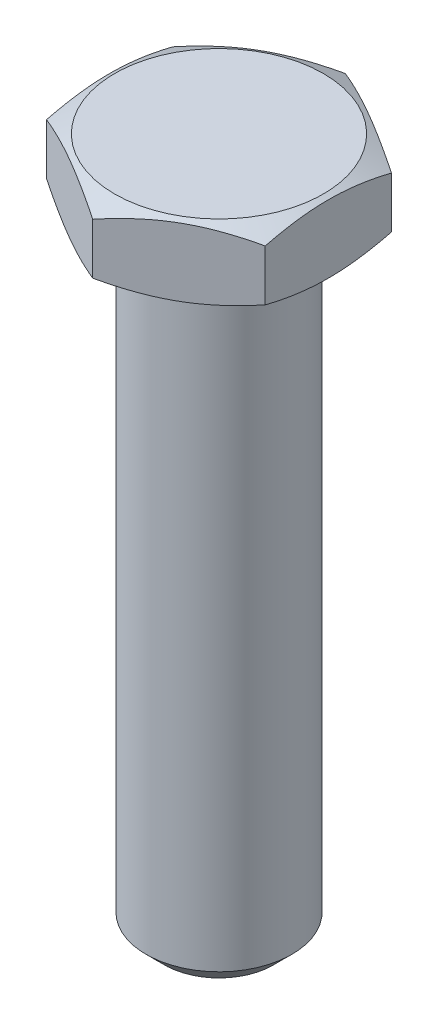
ISO-10303-21;
HEADER;
FILE_DESCRIPTION(('STEP AP214'),'2;1');
FILE_NAME('part.step','',(''),(''),'','','');
FILE_SCHEMA(('AUTOMOTIVE_DESIGN { 1 0 10303 214 1 1 1 1 }'));
ENDSEC;
DATA;
#1=APPLICATION_CONTEXT('core data for automotive mechanical design processes');
#2=APPLICATION_PROTOCOL_DEFINITION('international standard','automotive_design',2000,#1);
#3=PRODUCT_CONTEXT('',#1,'mechanical');
#4=PRODUCT('Part','Part','',(#3));
#5=PRODUCT_RELATED_PRODUCT_CATEGORY('part','',(#4));
#6=PRODUCT_DEFINITION_FORMATION('','',#4);
#7=PRODUCT_DEFINITION_CONTEXT('part definition',#1,'design');
#8=PRODUCT_DEFINITION('design','',#6,#7);
#9=PRODUCT_DEFINITION_SHAPE('','',#8);
#10=(LENGTH_UNIT() NAMED_UNIT(*) SI_UNIT(.MILLI.,.METRE.));
#11=(NAMED_UNIT(*) PLANE_ANGLE_UNIT() SI_UNIT($,.RADIAN.));
#12=(NAMED_UNIT(*) SI_UNIT($,.STERADIAN.) SOLID_ANGLE_UNIT());
#13=UNCERTAINTY_MEASURE_WITH_UNIT(LENGTH_MEASURE(1.E-05),#10,'distance_accuracy_value','');
#14=(GEOMETRIC_REPRESENTATION_CONTEXT(3) GLOBAL_UNCERTAINTY_ASSIGNED_CONTEXT((#13)) GLOBAL_UNIT_ASSIGNED_CONTEXT((#10,
#11,#12)) REPRESENTATION_CONTEXT('',''));
#15=CARTESIAN_POINT('',(0.,0.,0.));
#16=DIRECTION('',(0.,0.,1.));
#17=DIRECTION('',(1.,0.,0.));
#18=AXIS2_PLACEMENT_3D('',#15,#16,#17);
#19=CARTESIAN_POINT('',(0.,0.,0.));
#20=DIRECTION('',(0.,1.,0.));
#21=DIRECTION('',(0.,0.,1.));
#22=AXIS2_PLACEMENT_3D('',#19,#20,#21);
#23=PLANE('',#22);
#24=CARTESIAN_POINT('',(0.,0.,0.));
#25=DIRECTION('',(0.,-1.,0.));
#26=DIRECTION('',(0.,0.,-1.));
#27=AXIS2_PLACEMENT_3D('',#24,#25,#26);
#28=CIRCLE('',#27,2.);
#29=CARTESIAN_POINT('',(0.,0.,-2.));
#30=VERTEX_POINT('',#29);
#31=EDGE_CURVE('E127',#30,#30,#28,.T.);
#32=ORIENTED_EDGE('',*,*,#31,.F.);
#33=EDGE_LOOP('',(#32));
#34=FACE_BOUND('',#33,.T.);
#35=CARTESIAN_POINT('',(0.,0.,0.));
#36=DIRECTION('',(0.,-1.,0.));
#37=DIRECTION('',(0.,0.,-1.));
#38=AXIS2_PLACEMENT_3D('',#35,#36,#37);
#39=CIRCLE('',#38,2.86410161513776);
#40=CARTESIAN_POINT('',(0.,0.,-2.86410161513776));
#41=VERTEX_POINT('',#40);
#42=EDGE_CURVE('E259',#41,#41,#39,.T.);
#43=ORIENTED_EDGE('',*,*,#42,.T.);
#44=EDGE_LOOP('',(#43));
#45=FACE_BOUND('',#44,.T.);
#46=ADVANCED_FACE('F41',(#34,#45),#23,.F.);
#47=CARTESIAN_POINT('',(0.,-17.,0.));
#48=DIRECTION('',(0.,1.,0.));
#49=DIRECTION('',(0.,0.,1.));
#50=AXIS2_PLACEMENT_3D('',#47,#48,#49);
#51=CYLINDRICAL_SURFACE('',#50,2.);
#52=CARTESIAN_POINT('',(0.,-16.5,0.));
#53=DIRECTION('',(0.,-1.,0.));
#54=DIRECTION('',(0.,0.,-1.));
#55=AXIS2_PLACEMENT_3D('',#52,#53,#54);
#56=CIRCLE('',#55,2.);
#57=CARTESIAN_POINT('',(0.,-16.5,-2.));
#58=VERTEX_POINT('',#57);
#59=EDGE_CURVE('E11',#58,#58,#56,.F.);
#60=ORIENTED_EDGE('',*,*,#59,.T.);
#61=EDGE_LOOP('',(#60));
#62=FACE_BOUND('',#61,.T.);
#63=ORIENTED_EDGE('',*,*,#31,.T.);
#64=EDGE_LOOP('',(#63));
#65=FACE_BOUND('',#64,.T.);
#66=ADVANCED_FACE('F237',(#62,#65),#51,.T.);
#67=CARTESIAN_POINT('',(0.,-17.,0.));
#68=DIRECTION('',(0.,-1.,0.));
#69=DIRECTION('',(0.,0.,-1.));
#70=AXIS2_PLACEMENT_3D('',#67,#68,#69);
#71=PLANE('',#70);
#72=CARTESIAN_POINT('',(0.,-17.,0.));
#73=DIRECTION('',(0.,-1.,0.));
#74=DIRECTION('',(0.,0.,-1.));
#75=AXIS2_PLACEMENT_3D('',#72,#73,#74);
#76=CIRCLE('',#75,1.50000000000001);
#77=CARTESIAN_POINT('',(0.,-17.,-1.50000000000001));
#78=VERTEX_POINT('',#77);
#79=EDGE_CURVE('E50',#78,#78,#76,.T.);
#80=ORIENTED_EDGE('',*,*,#79,.T.);
#81=EDGE_LOOP('',(#80));
#82=FACE_BOUND('',#81,.T.);
#83=ADVANCED_FACE('F243',(#82),#71,.T.);
#84=CARTESIAN_POINT('',(0.,-17.,0.));
#85=DIRECTION('',(0.,1.,0.));
#86=DIRECTION('',(0.,0.,1.));
#87=AXIS2_PLACEMENT_3D('',#84,#85,#86);
#88=CONICAL_SURFACE('',#87,1.50000000000001,0.785398163397448);
#89=ORIENTED_EDGE('',*,*,#59,.F.);
#90=EDGE_LOOP('',(#89));
#91=FACE_BOUND('',#90,.T.);
#92=ORIENTED_EDGE('',*,*,#79,.F.);
#93=EDGE_LOOP('',(#92));
#94=FACE_BOUND('',#93,.T.);
#95=ADVANCED_FACE('F44',(#91,#94),#88,.T.);
#96=CARTESIAN_POINT('',(0.,0.,0.));
#97=DIRECTION('',(0.,1.,0.));
#98=DIRECTION('',(0.,0.,1.));
#99=AXIS2_PLACEMENT_3D('',#96,#97,#98);
#100=CONICAL_SURFACE('',#99,2.86410161513776,1.10714871779409);
#101=ORIENTED_EDGE('',*,*,#42,.F.);
#102=EDGE_LOOP('',(#101));
#103=FACE_BOUND('',#102,.T.);
#104=CARTESIAN_POINT('',(0.0002,0.300057737913574,3.4642170851916));
#105=CARTESIAN_POINT('',(-0.0843576975081392,0.275647401119735,3.41539767577322));
#106=CARTESIAN_POINT('',(-0.169244830523354,0.252685545957684,3.36638806667615));
#107=CARTESIAN_POINT('',(-0.339695256808321,0.210142328352822,3.26797846717704));
#108=CARTESIAN_POINT('',(-0.425258874743314,0.190562706924008,3.21857828932943));
#109=CARTESIAN_POINT('',(-0.597119853282431,0.15526744743101,3.11935430710668));
#110=CARTESIAN_POINT('',(-0.683418112738016,0.139557573650432,3.0695299837794));
#111=CARTESIAN_POINT('',(-0.856518299579659,0.112523608519719,2.96959054430961));
#112=CARTESIAN_POINT('',(-0.943320137526851,0.101198761186187,2.91947547980464));
#113=CARTESIAN_POINT('',(-1.11532356000646,0.0835326143848697,2.8201692575345));
#114=CARTESIAN_POINT('',(-1.20051680390757,0.0770841419711611,2.77098291523506));
#115=CARTESIAN_POINT('',(-1.3710806980937,0.0689930139080331,2.67250780501267));
#116=CARTESIAN_POINT('',(-1.4564513569198,0.0673505952579314,2.62321903215853));
#117=CARTESIAN_POINT('',(-1.62706618222961,0.0689352741171345,2.52471451683817));
#118=CARTESIAN_POINT('',(-1.71231038587662,0.0721571252475173,2.47549875291571));
#119=CARTESIAN_POINT('',(-1.88255588188678,0.0833364795480117,2.37720746996593));
#120=CARTESIAN_POINT('',(-1.96755719433661,0.0912935790212909,2.32813193934154));
#121=CARTESIAN_POINT('',(-2.13183052204708,0.111015671851011,2.23328868936723));
#122=CARTESIAN_POINT('',(-2.21112723767509,0.122510276351391,2.18750670925355));
#123=CARTESIAN_POINT('',(-2.36927515535497,0.149078979856735,2.09619996640929));
#124=CARTESIAN_POINT('',(-2.44812630887963,0.164153461344515,2.05067523169592));
#125=CARTESIAN_POINT('',(-2.60619009037454,0.197692594574929,1.9594170649007));
#126=CARTESIAN_POINT('',(-2.68539694087637,0.216193183407675,1.91368696844181));
#127=CARTESIAN_POINT('',(-2.84322932268019,0.256068030127482,1.82256240032053));
#128=CARTESIAN_POINT('',(-2.92185510791947,0.277440943484195,1.77716778204739));
#129=CARTESIAN_POINT('',(-3.00019999999998,0.300057737913565,1.73193533751508));
#130=B_SPLINE_CURVE_WITH_KNOTS('',3,(#104,#105,#106,#107,#108,#109,#110,#111,#112,#113,#114,
#115,#116,#117,#118,#119,#120,#121,#122,#123,#124,#125,#126,#127,#128,#129),.UNSPECIFIED.,.F.,
.F.,(4,2,2,2,2,2,2,2,2,2,2,2,4),(0.,0.30194726219014,0.604049492370199,0.906599041906776,
1.20909640831849,1.50473507111981,1.8003883124057,2.09572290334755,2.39103231956712,
2.6678041927483,2.94460565022812,3.22449442184109,3.50425263138383),.UNSPECIFIED.);
#131=CARTESIAN_POINT('',(0.,0.3,3.46410161513776));
#132=VERTEX_POINT('',#131);
#133=CARTESIAN_POINT('',(-2.99999999999998,0.3,1.73205080756891));
#134=VERTEX_POINT('',#133);
#135=EDGE_CURVE('E65',#132,#134,#130,.T.);
#136=ORIENTED_EDGE('',*,*,#135,.T.);
#137=CARTESIAN_POINT('',(-2.99999999999995,1.57365208973094,5.20931853771167));
#138=CARTESIAN_POINT('',(-2.99999999999995,1.50998777174429,5.06234715778561));
#139=CARTESIAN_POINT('',(-2.99999999999995,1.44686080061693,4.91513933371793));
#140=CARTESIAN_POINT('',(-2.99999999999995,1.32200063682017,4.62011582974534));
#141=CARTESIAN_POINT('',(-2.99999999999995,1.2602675937212,4.47230008660262));
#142=CARTESIAN_POINT('',(-2.99999999999996,1.13833486888092,4.17548672752289));
#143=CARTESIAN_POINT('',(-2.99999999999996,1.0781406771681,4.02648684930349));
#144=CARTESIAN_POINT('',(-2.99999999999996,0.959955050135367,3.72761884619292));
#145=CARTESIAN_POINT('',(-2.99999999999996,0.901963544184566,3.57775074931979));
#146=CARTESIAN_POINT('',(-2.99999999999997,0.788824882896837,3.27703540236973));
#147=CARTESIAN_POINT('',(-2.99999999999997,0.733676151974605,3.12618874800314));
#148=CARTESIAN_POINT('',(-2.99999999999997,0.62700695322521,2.82319976965895));
#149=CARTESIAN_POINT('',(-2.99999999999997,0.57548672764544,2.67105735993236));
#150=CARTESIAN_POINT('',(-2.99999999999998,0.477215570873933,2.36535124180871));
#151=CARTESIAN_POINT('',(-2.99999999999998,0.430460988404545,2.21178872135961));
#152=CARTESIAN_POINT('',(-2.99999999999998,0.343122134809374,1.90294104127946));
#153=CARTESIAN_POINT('',(-2.99999999999998,0.302536863189613,1.74765616535957));
#154=CARTESIAN_POINT('',(-2.99999999999999,0.217243398300895,1.3835825245628));
#155=CARTESIAN_POINT('',(-2.99999999999999,0.175590776953814,1.17404022002667));
#156=CARTESIAN_POINT('',(-2.99999999999999,0.127234224923284,0.857651670539613));
#157=CARTESIAN_POINT('',(-2.99999999999999,0.113470919288,0.751871866627188));
#158=CARTESIAN_POINT('',(-2.99999999999999,0.0911544101081223,0.53977059339254));
#159=CARTESIAN_POINT('',(-3.,0.0826003365060806,0.433449217517799));
#160=CARTESIAN_POINT('',(-3.,0.0710718074881545,0.220640891235554));
#161=CARTESIAN_POINT('',(-3.,0.0680900601100706,0.114154339976398));
#162=CARTESIAN_POINT('',(-3.,0.0678181153856516,-0.0988254262630418));
#163=CARTESIAN_POINT('',(-3.,0.0705278807725636,-0.205318641195128));
#164=CARTESIAN_POINT('',(-3.,0.0815180697245937,-0.41804688347734));
#165=CARTESIAN_POINT('',(-3.00000000000001,0.089800193781176,-0.524281822075484));
#166=CARTESIAN_POINT('',(-3.00000000000001,0.111584885970215,-0.736208045596922));
#167=CARTESIAN_POINT('',(-3.00000000000001,0.12508766374203,-0.841899308515779));
#168=CARTESIAN_POINT('',(-3.00000000000001,0.196196382554001,-1.31427546343626));
#169=CARTESIAN_POINT('',(-3.00000000000002,0.280033014659497,-1.67705776370225));
#170=CARTESIAN_POINT('',(-3.00000000000002,0.430754802063309,-2.21409746209015));
#171=CARTESIAN_POINT('',(-3.00000000000003,0.485302440571465,-2.39230116942601));
#172=CARTESIAN_POINT('',(-3.00000000000003,0.600580616156178,-2.74671776798335));
#173=CARTESIAN_POINT('',(-3.00000000000003,0.661310093073063,-2.92293099482464));
#174=CARTESIAN_POINT('',(-3.00000000000003,0.78873332759138,-3.27766551467015));
#175=CARTESIAN_POINT('',(-3.00000000000004,0.855531002285068,-3.4561487162901));
#176=CARTESIAN_POINT('',(-3.00000000000004,0.99265452512781,-3.811767109759));
#177=CARTESIAN_POINT('',(-3.00000000000004,1.06298061784278,-3.9889022071838));
#178=CARTESIAN_POINT('',(-3.00000000000005,1.20559269856673,-4.34040797090196));
#179=CARTESIAN_POINT('',(-3.00000000000005,1.27785357559381,-4.51478888607757));
#180=CARTESIAN_POINT('',(-3.00000000000005,1.42438447887457,-4.86266009428369));
#181=CARTESIAN_POINT('',(-3.00000000000005,1.49865405429227,-5.03615057693348));
#182=CARTESIAN_POINT('',(-3.00000000000005,1.57365208973094,-5.2093185377116));
#183=B_SPLINE_CURVE_WITH_KNOTS('',3,(#137,#138,#139,#140,#141,#142,#143,#144,#145,#146,#147,
#148,#149,#150,#151,#152,#153,#154,#155,#156,#157,#158,#159,#160,#161,#162,#163,#164,#165,#166,
#167,#168,#169,#170,#171,#172,#173,#174,#175,#176,#177,#178,#179,#180,#181,#182),.UNSPECIFIED.,
.F.,.F.,(4,2,2,2,2,2,2,2,2,2,2,2,2,2,2,2,2,2,2,2,2,2,4),(0.,0.480507448937208,0.961066214313064,
1.44315057868083,1.9252194715518,2.40701824365513,2.88884915132465,3.37030807653175,
3.85168883873877,4.49184876467322,4.81175569931051,5.13160918771951,5.45104382104259,
5.77047636278564,6.090006428551,6.40954932662424,7.52291980310329,8.08204041752274,
8.64106530610462,9.21274892896984,9.7844722319424,10.3507390280429,10.916879767946),.UNSPECIFIED.);
#184=CARTESIAN_POINT('',(-3.00000000000002,0.3,-1.73205080756885));
#185=VERTEX_POINT('',#184);
#186=EDGE_CURVE('E98',#134,#185,#183,.T.);
#187=ORIENTED_EDGE('',*,*,#186,.T.);
#188=CARTESIAN_POINT('',(-3.00020000000002,0.300057737913574,-1.73193533751501));
#189=CARTESIAN_POINT('',(-2.91564230249188,0.275647401119734,-1.78075474693339));
#190=CARTESIAN_POINT('',(-2.83075516947666,0.252685545957683,-1.82976435603046));
#191=CARTESIAN_POINT('',(-2.6603047431917,0.21014232835282,-1.92817395552958));
#192=CARTESIAN_POINT('',(-2.57474112525671,0.190562706924006,-1.97757413337718));
#193=CARTESIAN_POINT('',(-2.40288014671759,0.155267447431008,-2.07679811559994));
#194=CARTESIAN_POINT('',(-2.31658188726201,0.139557573650429,-2.12662243892722));
#195=CARTESIAN_POINT('',(-2.14348170042036,0.112523608519715,-2.22656187839701));
#196=CARTESIAN_POINT('',(-2.05667986247317,0.101198761186183,-2.27667694290198));
#197=CARTESIAN_POINT('',(-1.88467643999356,0.0835326143848648,-2.37598316517212));
#198=CARTESIAN_POINT('',(-1.79948319609245,0.0770841419711559,-2.42516950747157));
#199=CARTESIAN_POINT('',(-1.62891930190632,0.0689930139080275,-2.52364461769396));
#200=CARTESIAN_POINT('',(-1.54354864308023,0.0673505952579256,-2.5729333905481));
#201=CARTESIAN_POINT('',(-1.37293381777042,0.0689352741171282,-2.67143790586847));
#202=CARTESIAN_POINT('',(-1.2876896141234,0.0721571252475105,-2.72065366979093));
#203=CARTESIAN_POINT('',(-1.11744411811325,0.0833364795480045,-2.81894495274071));
#204=CARTESIAN_POINT('',(-1.03244280566342,0.0912935790212837,-2.86802048336509));
#205=CARTESIAN_POINT('',(-0.86816947795295,0.111015671851003,-2.96286373333941));
#206=CARTESIAN_POINT('',(-0.788872762324933,0.122510276351384,-3.0086457134531));
#207=CARTESIAN_POINT('',(-0.630724844645052,0.149078979856729,-3.09995245629736));
#208=CARTESIAN_POINT('',(-0.551873691120394,0.16415346134451,-3.14547719101073));
#209=CARTESIAN_POINT('',(-0.393809909625476,0.197692594574925,-3.23673535780596));
#210=CARTESIAN_POINT('',(-0.314603059123648,0.216193183407671,-3.28246545426485));
#211=CARTESIAN_POINT('',(-0.156770677319818,0.25606803012748,-3.37359002238613));
#212=CARTESIAN_POINT('',(-0.0781448920805363,0.277440943484193,-3.41898464065928));
#213=CARTESIAN_POINT('',(0.000199999999976549,0.300057737913565,-3.4642170851916));
#214=B_SPLINE_CURVE_WITH_KNOTS('',3,(#188,#189,#190,#191,#192,#193,#194,#195,#196,#197,#198,
#199,#200,#201,#202,#203,#204,#205,#206,#207,#208,#209,#210,#211,#212,#213),.UNSPECIFIED.,.F.,
.F.,(4,2,2,2,2,2,2,2,2,2,2,2,4),(0.,0.301947262190141,0.604049492370201,0.90659904190678,
1.20909640831849,1.50473507111981,1.8003883124057,2.09572290334756,2.39103231956712,
2.66780419274832,2.94460565022814,3.22449442184113,3.50425263138387),.UNSPECIFIED.);
#215=CARTESIAN_POINT('',(0.,0.3,-3.46410161513776));
#216=VERTEX_POINT('',#215);
#217=EDGE_CURVE('E93',#185,#216,#214,.T.);
#218=ORIENTED_EDGE('',*,*,#217,.T.);
#219=CARTESIAN_POINT('',(-0.00020000000002419,0.300057737913574,-3.46421708519159));
#220=CARTESIAN_POINT('',(0.0843576975081151,0.275647401119734,-3.41539767577322));
#221=CARTESIAN_POINT('',(0.16924483052333,0.252685545957683,-3.36638806667615));
#222=CARTESIAN_POINT('',(0.339695256808297,0.21014232835282,-3.26797846717704));
#223=CARTESIAN_POINT('',(0.42525887474329,0.190562706924006,-3.21857828932943));
#224=CARTESIAN_POINT('',(0.597119853282408,0.155267447431007,-3.11935430710668));
#225=CARTESIAN_POINT('',(0.683418112737993,0.139557573650428,-3.0695299837794));
#226=CARTESIAN_POINT('',(0.856518299579637,0.112523608519715,-2.96959054430961));
#227=CARTESIAN_POINT('',(0.943320137526829,0.101198761186183,-2.91947547980464));
#228=CARTESIAN_POINT('',(1.11532356000644,0.0835326143848647,-2.8201692575345));
#229=CARTESIAN_POINT('',(1.20051680390755,0.0770841419711557,-2.77098291523506));
#230=CARTESIAN_POINT('',(1.37108069809368,0.0689930139080273,-2.67250780501267));
#231=CARTESIAN_POINT('',(1.45645135691978,0.0673505952579254,-2.62321903215852));
#232=CARTESIAN_POINT('',(1.62706618222959,0.068935274117128,-2.52471451683816));
#233=CARTESIAN_POINT('',(1.7123103858766,0.0721571252475103,-2.47549875291571));
#234=CARTESIAN_POINT('',(1.88255588188676,0.0833364795480044,-2.37720746996592));
#235=CARTESIAN_POINT('',(1.96755719433659,0.0912935790212837,-2.32813193934154));
#236=CARTESIAN_POINT('',(2.13183052204706,0.111015671851003,-2.23328868936723));
#237=CARTESIAN_POINT('',(2.21112723767508,0.122510276351384,-2.18750670925354));
#238=CARTESIAN_POINT('',(2.36927515535496,0.149078979856729,-2.09619996640928));
#239=CARTESIAN_POINT('',(2.44812630887962,0.16415346134451,-2.05067523169591));
#240=CARTESIAN_POINT('',(2.60619009037454,0.197692594574925,-1.95941706490069));
#241=CARTESIAN_POINT('',(2.68539694087637,0.216193183407671,-1.9136869684418));
#242=CARTESIAN_POINT('',(2.8432293226802,0.25606803012748,-1.82256240032051));
#243=CARTESIAN_POINT('',(2.92185510791948,0.277440943484194,-1.77716778204737));
#244=CARTESIAN_POINT('',(3.0002,0.300057737913565,-1.73193533751505));
#245=B_SPLINE_CURVE_WITH_KNOTS('',3,(#219,#220,#221,#222,#223,#224,#225,#226,#227,#228,#229,
#230,#231,#232,#233,#234,#235,#236,#237,#238,#239,#240,#241,#242,#243,#244),.UNSPECIFIED.,.F.,
.F.,(4,2,2,2,2,2,2,2,2,2,2,2,4),(0.,0.301947262190141,0.604049492370201,0.906599041906779,
1.20909640831849,1.50473507111981,1.8003883124057,2.09572290334756,2.39103231956712,
2.66780419274832,2.94460565022814,3.22449442184113,3.50425263138387),.UNSPECIFIED.);
#246=CARTESIAN_POINT('',(2.99999999999999,0.3,-1.73205080756889));
#247=VERTEX_POINT('',#246);
#248=EDGE_CURVE('E96',#216,#247,#245,.T.);
#249=ORIENTED_EDGE('',*,*,#248,.T.);
#250=CARTESIAN_POINT('',(2.99999999999998,1.57365208973094,-5.20931853771164));
#251=CARTESIAN_POINT('',(2.99999999999998,1.50998777174429,-5.06234715778559));
#252=CARTESIAN_POINT('',(2.99999999999998,1.44686080061693,-4.91513933371791));
#253=CARTESIAN_POINT('',(2.99999999999998,1.32200063682017,-4.62011582974532));
#254=CARTESIAN_POINT('',(2.99999999999999,1.2602675937212,-4.47230008660259));
#255=CARTESIAN_POINT('',(2.99999999999999,1.13833486888092,-4.17548672752287));
#256=CARTESIAN_POINT('',(2.99999999999999,1.0781406771681,-4.02648684930347));
#257=CARTESIAN_POINT('',(2.99999999999999,0.959955050135367,-3.7276188461929));
#258=CARTESIAN_POINT('',(2.99999999999999,0.901963544184565,-3.57775074931977));
#259=CARTESIAN_POINT('',(2.99999999999999,0.788824882896836,-3.27703540236971));
#260=CARTESIAN_POINT('',(2.99999999999999,0.733676151974604,-3.12618874800312));
#261=CARTESIAN_POINT('',(2.99999999999999,0.627006953225211,-2.82319976965892));
#262=CARTESIAN_POINT('',(2.99999999999999,0.57548672764544,-2.67105735993234));
#263=CARTESIAN_POINT('',(2.99999999999999,0.477215570873933,-2.36535124180869));
#264=CARTESIAN_POINT('',(2.99999999999999,0.430460988404545,-2.21178872135959));
#265=CARTESIAN_POINT('',(2.99999999999999,0.343122134809374,-1.90294104127944));
#266=CARTESIAN_POINT('',(2.99999999999999,0.302536863189613,-1.74765616535955));
#267=CARTESIAN_POINT('',(3.,0.217243398300895,-1.38358252456278));
#268=CARTESIAN_POINT('',(3.,0.175590776953814,-1.17404022002664));
#269=CARTESIAN_POINT('',(3.,0.127234224923284,-0.85765167053959));
#270=CARTESIAN_POINT('',(3.,0.113470919288,-0.751871866627165));
#271=CARTESIAN_POINT('',(3.,0.0911544101081221,-0.539770593392516));
#272=CARTESIAN_POINT('',(3.,0.0826003365060805,-0.433449217517775));
#273=CARTESIAN_POINT('',(3.,0.0710718074881544,-0.220640891235532));
#274=CARTESIAN_POINT('',(3.,0.0680900601100706,-0.114154339976376));
#275=CARTESIAN_POINT('',(3.,0.0678181153856516,0.0988254262630639));
#276=CARTESIAN_POINT('',(3.,0.0705278807725635,0.205318641195151));
#277=CARTESIAN_POINT('',(3.,0.0815180697245936,0.418046883477362));
#278=CARTESIAN_POINT('',(3.,0.089800193781176,0.524281822075506));
#279=CARTESIAN_POINT('',(3.,0.111584885970216,0.736208045596944));
#280=CARTESIAN_POINT('',(3.,0.12508766374203,0.841899308515801));
#281=CARTESIAN_POINT('',(3.,0.196196382554001,1.31427546343628));
#282=CARTESIAN_POINT('',(3.00000000000001,0.280033014659497,1.67705776370227));
#283=CARTESIAN_POINT('',(3.00000000000001,0.430754802063309,2.21409746209017));
#284=CARTESIAN_POINT('',(3.00000000000001,0.485302440571465,2.39230116942603));
#285=CARTESIAN_POINT('',(3.00000000000001,0.600580616156178,2.74671776798337));
#286=CARTESIAN_POINT('',(3.00000000000001,0.661310093073063,2.92293099482466));
#287=CARTESIAN_POINT('',(3.00000000000001,0.78873332759138,3.27766551467017));
#288=CARTESIAN_POINT('',(3.00000000000001,0.855531002285067,3.45614871629012));
#289=CARTESIAN_POINT('',(3.00000000000001,0.992654525127809,3.81176710975902));
#290=CARTESIAN_POINT('',(3.00000000000001,1.06298061784278,3.98890220718382));
#291=CARTESIAN_POINT('',(3.00000000000001,1.20559269856673,4.34040797090198));
#292=CARTESIAN_POINT('',(3.00000000000001,1.27785357559381,4.51478888607759));
#293=CARTESIAN_POINT('',(3.00000000000002,1.42438447887457,4.86266009428371));
#294=CARTESIAN_POINT('',(3.00000000000002,1.49865405429227,5.0361505769335));
#295=CARTESIAN_POINT('',(3.00000000000002,1.57365208973094,5.20931853771162));
#296=B_SPLINE_CURVE_WITH_KNOTS('',3,(#250,#251,#252,#253,#254,#255,#256,#257,#258,#259,#260,
#261,#262,#263,#264,#265,#266,#267,#268,#269,#270,#271,#272,#273,#274,#275,#276,#277,#278,#279,
#280,#281,#282,#283,#284,#285,#286,#287,#288,#289,#290,#291,#292,#293,#294,#295),.UNSPECIFIED.,
.F.,.F.,(4,2,2,2,2,2,2,2,2,2,2,2,2,2,2,2,2,2,2,2,2,2,4),(0.,0.480507448937209,0.961066214313064,
1.44315057868083,1.9252194715518,2.40701824365513,2.88884915132465,3.37030807653175,
3.85168883873877,4.49184876467322,4.81175569931051,5.13160918771951,5.45104382104259,
5.77047636278564,6.090006428551,6.40954932662424,7.52291980310329,8.08204041752274,
8.64106530610462,9.21274892896984,9.7844722319424,10.3507390280429,10.916879767946),.UNSPECIFIED.);
#297=CARTESIAN_POINT('',(3.00000000000001,0.3,1.73205080756887));
#298=VERTEX_POINT('',#297);
#299=EDGE_CURVE('E112',#247,#298,#296,.T.);
#300=ORIENTED_EDGE('',*,*,#299,.T.);
#301=CARTESIAN_POINT('',(3.00020000000001,0.300057737913574,1.73193533751503));
#302=CARTESIAN_POINT('',(2.91564230249187,0.275647401119734,1.78075474693341));
#303=CARTESIAN_POINT('',(2.83075516947665,0.252685545957683,1.82976435603048));
#304=CARTESIAN_POINT('',(2.66030474319169,0.21014232835282,1.9281739555296));
#305=CARTESIAN_POINT('',(2.57474112525669,0.190562706924006,1.9775741333772));
#306=CARTESIAN_POINT('',(2.40288014671758,0.155267447431008,2.07679811559995));
#307=CARTESIAN_POINT('',(2.31658188726199,0.139557573650429,2.12662243892723));
#308=CARTESIAN_POINT('',(2.14348170042035,0.112523608519715,2.22656187839703));
#309=CARTESIAN_POINT('',(2.05667986247316,0.101198761186183,2.27667694290199));
#310=CARTESIAN_POINT('',(1.88467643999354,0.0835326143848648,2.37598316517214));
#311=CARTESIAN_POINT('',(1.79948319609244,0.0770841419711559,2.42516950747158));
#312=CARTESIAN_POINT('',(1.62891930190631,0.0689930139080275,2.52364461769397));
#313=CARTESIAN_POINT('',(1.54354864308021,0.0673505952579255,2.57293339054811));
#314=CARTESIAN_POINT('',(1.3729338177704,0.0689352741171282,2.67143790586848));
#315=CARTESIAN_POINT('',(1.28768961412338,0.0721571252475107,2.72065366979093));
#316=CARTESIAN_POINT('',(1.11744411811323,0.0833364795480046,2.81894495274072));
#317=CARTESIAN_POINT('',(1.0324428056634,0.0912935790212837,2.8680204833651));
#318=CARTESIAN_POINT('',(0.86816947795293,0.111015671851003,2.96286373333941));
#319=CARTESIAN_POINT('',(0.788872762324912,0.122510276351384,3.0086457134531));
#320=CARTESIAN_POINT('',(0.630724844645031,0.14907897985673,3.09995245629736));
#321=CARTESIAN_POINT('',(0.551873691120372,0.16415346134451,3.14547719101074));
#322=CARTESIAN_POINT('',(0.393809909625454,0.197692594574925,3.23673535780596));
#323=CARTESIAN_POINT('',(0.314603059123625,0.216193183407671,3.28246545426485));
#324=CARTESIAN_POINT('',(0.156770677319794,0.25606803012748,3.37359002238613));
#325=CARTESIAN_POINT('',(0.0781448920805121,0.277440943484194,3.41898464065928));
#326=CARTESIAN_POINT('',(-0.000200000000000854,0.300057737913565,3.4642170851916));
#327=B_SPLINE_CURVE_WITH_KNOTS('',3,(#301,#302,#303,#304,#305,#306,#307,#308,#309,#310,#311,
#312,#313,#314,#315,#316,#317,#318,#319,#320,#321,#322,#323,#324,#325,#326),.UNSPECIFIED.,.F.,
.F.,(4,2,2,2,2,2,2,2,2,2,2,2,4),(0.,0.301947262190141,0.604049492370202,0.906599041906779,
1.20909640831849,1.50473507111981,1.8003883124057,2.09572290334756,2.39103231956712,
2.66780419274832,2.94460565022814,3.22449442184113,3.50425263138387),.UNSPECIFIED.);
#328=EDGE_CURVE('E220',#298,#132,#327,.T.);
#329=ORIENTED_EDGE('',*,*,#328,.T.);
#330=EDGE_LOOP('',(#136,#187,#218,#249,#300,#329));
#331=FACE_BOUND('',#330,.T.);
#332=ADVANCED_FACE('F95',(#103,#331),#100,.T.);
#333=CARTESIAN_POINT('',(-3.00000000000002,2.,-1.73205080756885));
#334=DIRECTION('',(1.,0.,0.));
#335=DIRECTION('',(0.,0.,-1.));
#336=AXIS2_PLACEMENT_3D('',#333,#334,#335);
#337=PLANE('',#336);
#338=CARTESIAN_POINT('',(-3.00000000000005,0.426347910269061,-5.2093185377116));
#339=CARTESIAN_POINT('',(-3.00000000000005,0.490012228255707,-5.06234715778555));
#340=CARTESIAN_POINT('',(-3.00000000000005,0.553139199383066,-4.91513933371787));
#341=CARTESIAN_POINT('',(-3.00000000000005,0.677999363179832,-4.62011582974528));
#342=CARTESIAN_POINT('',(-3.00000000000005,0.739732406278803,-4.47230008660255));
#343=CARTESIAN_POINT('',(-3.00000000000004,0.861665131119081,-4.17548672752283));
#344=CARTESIAN_POINT('',(-3.00000000000004,0.921859322831904,-4.02648684930343));
#345=CARTESIAN_POINT('',(-3.00000000000004,1.04004494986463,-3.72761884619286));
#346=CARTESIAN_POINT('',(-3.00000000000004,1.09803645581543,-3.57775074931973));
#347=CARTESIAN_POINT('',(-3.00000000000003,1.21117511710316,-3.27703540236967));
#348=CARTESIAN_POINT('',(-3.00000000000003,1.2663238480254,-3.12618874800308));
#349=CARTESIAN_POINT('',(-3.00000000000003,1.37299304677479,-2.82319976965888));
#350=CARTESIAN_POINT('',(-3.00000000000003,1.42451327235456,-2.67105735993229));
#351=CARTESIAN_POINT('',(-3.00000000000002,1.52278442912607,-2.36535124180865));
#352=CARTESIAN_POINT('',(-3.00000000000002,1.56953901159545,-2.21178872135955));
#353=CARTESIAN_POINT('',(-3.00000000000002,1.65687786519063,-1.9029410412794));
#354=CARTESIAN_POINT('',(-3.00000000000002,1.69746313681039,-1.74765616535951));
#355=CARTESIAN_POINT('',(-3.00000000000001,1.7827566016991,-1.38358252456274));
#356=CARTESIAN_POINT('',(-3.00000000000001,1.82440922304619,-1.1740402200266));
#357=CARTESIAN_POINT('',(-3.00000000000001,1.87276577507672,-0.85765167053955));
#358=CARTESIAN_POINT('',(-3.00000000000001,1.886529080712,-0.751871866627125));
#359=CARTESIAN_POINT('',(-3.00000000000001,1.90884558989188,-0.539770593392477));
#360=CARTESIAN_POINT('',(-3.,1.91739966349392,-0.433449217517736));
#361=CARTESIAN_POINT('',(-3.,1.92892819251185,-0.220640891235492));
#362=CARTESIAN_POINT('',(-3.,1.93190993988993,-0.114154339976336));
#363=CARTESIAN_POINT('',(-3.,1.93218188461435,0.0988254262631044));
#364=CARTESIAN_POINT('',(-3.,1.92947211922744,0.205318641195191));
#365=CARTESIAN_POINT('',(-3.,1.91848193027541,0.418046883477402));
#366=CARTESIAN_POINT('',(-2.99999999999999,1.91019980621882,0.524281822075546));
#367=CARTESIAN_POINT('',(-2.99999999999999,1.88841511402978,0.736208045596984));
#368=CARTESIAN_POINT('',(-2.99999999999999,1.87491233625797,0.841899308515842));
#369=CARTESIAN_POINT('',(-2.99999999999999,1.803803617446,1.31427546343632));
#370=CARTESIAN_POINT('',(-2.99999999999998,1.7199669853405,1.67705776370232));
#371=CARTESIAN_POINT('',(-2.99999999999998,1.56924519793669,2.21409746209022));
#372=CARTESIAN_POINT('',(-2.99999999999998,1.51469755942853,2.39230116942608));
#373=CARTESIAN_POINT('',(-2.99999999999997,1.39941938384382,2.74671776798341));
#374=CARTESIAN_POINT('',(-2.99999999999997,1.33868990692694,2.9229309948247));
#375=CARTESIAN_POINT('',(-2.99999999999997,1.21126667240862,3.27766551467022));
#376=CARTESIAN_POINT('',(-2.99999999999996,1.14446899771493,3.45614871629016));
#377=CARTESIAN_POINT('',(-2.99999999999996,1.00734547487219,3.81176710975906));
#378=CARTESIAN_POINT('',(-2.99999999999996,0.937019382157217,3.98890220718386));
#379=CARTESIAN_POINT('',(-2.99999999999995,0.794407301433274,4.34040797090203));
#380=CARTESIAN_POINT('',(-2.99999999999995,0.722146424406186,4.51478888607763));
#381=CARTESIAN_POINT('',(-2.99999999999995,0.575615521125426,4.86266009428376));
#382=CARTESIAN_POINT('',(-2.99999999999995,0.50134594570773,5.03615057693354));
#383=CARTESIAN_POINT('',(-2.99999999999995,0.426347910269061,5.20931853771166));
#384=B_SPLINE_CURVE_WITH_KNOTS('',3,(#338,#339,#340,#341,#342,#343,#344,#345,#346,#347,#348,
#349,#350,#351,#352,#353,#354,#355,#356,#357,#358,#359,#360,#361,#362,#363,#364,#365,#366,#367,
#368,#369,#370,#371,#372,#373,#374,#375,#376,#377,#378,#379,#380,#381,#382,#383),.UNSPECIFIED.,
.F.,.F.,(4,2,2,2,2,2,2,2,2,2,2,2,2,2,2,2,2,2,2,2,2,2,4),(0.,0.480507448937209,0.961066214313064,
1.44315057868083,1.9252194715518,2.40701824365513,2.88884915132465,3.37030807653175,
3.85168883873877,4.49184876467322,4.81175569931051,5.13160918771951,5.45104382104259,
5.77047636278564,6.090006428551,6.40954932662424,7.52291980310329,8.08204041752274,
8.64106530610462,9.21274892896984,9.7844722319424,10.3507390280429,10.916879767946),.UNSPECIFIED.);
#385=CARTESIAN_POINT('',(-3.00000000000002,1.7,-1.73205080756885));
#386=VERTEX_POINT('',#385);
#387=CARTESIAN_POINT('',(-2.99999999999998,1.7,1.73205080756891));
#388=VERTEX_POINT('',#387);
#389=EDGE_CURVE('E178',#386,#388,#384,.T.);
#390=ORIENTED_EDGE('',*,*,#389,.F.);
#391=DIRECTION('',(0.,-1.,0.));
#392=VECTOR('',#391,1.);
#393=CARTESIAN_POINT('',(-3.00000000000002,2.,-1.73205080756885));
#394=LINE('',#393,#392);
#395=EDGE_CURVE('E115',#386,#185,#394,.T.);
#396=ORIENTED_EDGE('',*,*,#395,.T.);
#397=ORIENTED_EDGE('',*,*,#186,.F.);
#398=DIRECTION('',(0.,-1.,0.));
#399=VECTOR('',#398,1.);
#400=CARTESIAN_POINT('',(-2.99999999999998,2.,1.73205080756891));
#401=LINE('',#400,#399);
#402=EDGE_CURVE('E119',#388,#134,#401,.T.);
#403=ORIENTED_EDGE('',*,*,#402,.F.);
#404=EDGE_LOOP('',(#390,#396,#397,#403));
#405=FACE_BOUND('',#404,.T.);
#406=ADVANCED_FACE('F248',(#405),#337,.F.);
#407=CARTESIAN_POINT('',(0.,2.,-3.46410161513776));
#408=DIRECTION('',(0.500000000000007,0.,0.866025403784435));
#409=DIRECTION('',(0.866025403784435,0.,-0.500000000000007));
#410=AXIS2_PLACEMENT_3D('',#407,#408,#409);
#411=PLANE('',#410);
#412=CARTESIAN_POINT('',(0.000199999999975874,1.69994226208643,-3.46421708519159));
#413=CARTESIAN_POINT('',(-0.0843576975081628,1.72435259888027,-3.41539767577321));
#414=CARTESIAN_POINT('',(-0.169244830523377,1.74731445404232,-3.36638806667614));
#415=CARTESIAN_POINT('',(-0.339695256808343,1.78985767164718,-3.26797846717703));
#416=CARTESIAN_POINT('',(-0.425258874743336,1.80943729307599,-3.21857828932942));
#417=CARTESIAN_POINT('',(-0.597119853282452,1.84473255256899,-3.11935430710667));
#418=CARTESIAN_POINT('',(-0.683418112738036,1.86044242634957,-3.06952998377939));
#419=CARTESIAN_POINT('',(-0.856518299579678,1.88747639148029,-2.96959054430959));
#420=CARTESIAN_POINT('',(-0.94332013752687,1.89880123881382,-2.91947547980463));
#421=CARTESIAN_POINT('',(-1.11532356000648,1.91646738561514,-2.82016925753449));
#422=CARTESIAN_POINT('',(-1.20051680390759,1.92291585802884,-2.77098291523504));
#423=CARTESIAN_POINT('',(-1.37108069809372,1.93100698609197,-2.67250780501265));
#424=CARTESIAN_POINT('',(-1.45645135691981,1.93264940474207,-2.6232190321585));
#425=CARTESIAN_POINT('',(-1.62706618222963,1.93106472588287,-2.52471451683814));
#426=CARTESIAN_POINT('',(-1.71231038587664,1.92784287475249,-2.47549875291568));
#427=CARTESIAN_POINT('',(-1.88255588188679,1.916663520452,-2.3772074699659));
#428=CARTESIAN_POINT('',(-1.96755719433662,1.90870642097872,-2.32813193934151));
#429=CARTESIAN_POINT('',(-2.13183052204709,1.888984328149,-2.2332886893672));
#430=CARTESIAN_POINT('',(-2.21112723767511,1.87748972364862,-2.18750670925351));
#431=CARTESIAN_POINT('',(-2.36927515535499,1.85092102014327,-2.09619996640925));
#432=CARTESIAN_POINT('',(-2.44812630887965,1.83584653865549,-2.05067523169587));
#433=CARTESIAN_POINT('',(-2.60619009037457,1.80230740542508,-1.95941706490065));
#434=CARTESIAN_POINT('',(-2.68539694087639,1.78380681659233,-1.91368696844176));
#435=CARTESIAN_POINT('',(-2.84322932268022,1.74393196987252,-1.82256240032048));
#436=CARTESIAN_POINT('',(-2.92185510791951,1.72255905651581,-1.77716778204733));
#437=CARTESIAN_POINT('',(-3.00020000000002,1.69994226208644,-1.73193533751501));
#438=B_SPLINE_CURVE_WITH_KNOTS('',3,(#412,#413,#414,#415,#416,#417,#418,#419,#420,#421,#422,
#423,#424,#425,#426,#427,#428,#429,#430,#431,#432,#433,#434,#435,#436,#437),.UNSPECIFIED.,.F.,
.F.,(4,2,2,2,2,2,2,2,2,2,2,2,4),(0.,0.301947262190141,0.604049492370201,0.906599041906779,
1.20909640831849,1.50473507111981,1.8003883124057,2.09572290334756,2.39103231956712,
2.66780419274832,2.94460565022814,3.22449442184113,3.50425263138387),.UNSPECIFIED.);
#439=CARTESIAN_POINT('',(0.,1.7,-3.46410161513776));
#440=VERTEX_POINT('',#439);
#441=EDGE_CURVE('E57',#440,#386,#438,.T.);
#442=ORIENTED_EDGE('',*,*,#441,.F.);
#443=DIRECTION('',(0.,-1.,0.));
#444=VECTOR('',#443,1.);
#445=CARTESIAN_POINT('',(0.,2.,-3.46410161513776));
#446=LINE('',#445,#444);
#447=EDGE_CURVE('E109',#440,#216,#446,.T.);
#448=ORIENTED_EDGE('',*,*,#447,.T.);
#449=ORIENTED_EDGE('',*,*,#217,.F.);
#450=ORIENTED_EDGE('',*,*,#395,.F.);
#451=EDGE_LOOP('',(#442,#448,#449,#450));
#452=FACE_BOUND('',#451,.T.);
#453=ADVANCED_FACE('F114',(#452),#411,.F.);
#454=CARTESIAN_POINT('',(2.99999999999999,2.,-1.73205080756889));
#455=DIRECTION('',(-0.499999999999995,0.,0.866025403784442));
#456=DIRECTION('',(0.866025403784442,0.,0.499999999999995));
#457=AXIS2_PLACEMENT_3D('',#454,#455,#456);
#458=PLANE('',#457);
#459=CARTESIAN_POINT('',(3.00019999999999,1.69994226208643,-1.73193533751505));
#460=CARTESIAN_POINT('',(2.91564230249185,1.72435259888027,-1.78075474693343));
#461=CARTESIAN_POINT('',(2.83075516947664,1.74731445404232,-1.8297643560305));
#462=CARTESIAN_POINT('',(2.66030474319167,1.78985767164718,-1.92817395552961));
#463=CARTESIAN_POINT('',(2.57474112525668,1.80943729307599,-1.97757413337722));
#464=CARTESIAN_POINT('',(2.40288014671756,1.84473255256899,-2.07679811559997));
#465=CARTESIAN_POINT('',(2.31658188726198,1.86044242634957,-2.12662243892725));
#466=CARTESIAN_POINT('',(2.14348170042033,1.88747639148029,-2.22656187839704));
#467=CARTESIAN_POINT('',(2.05667986247314,1.89880123881382,-2.27667694290201));
#468=CARTESIAN_POINT('',(1.88467643999353,1.91646738561514,-2.37598316517215));
#469=CARTESIAN_POINT('',(1.79948319609242,1.92291585802884,-2.42516950747159));
#470=CARTESIAN_POINT('',(1.62891930190629,1.93100698609197,-2.52364461769398));
#471=CARTESIAN_POINT('',(1.54354864308019,1.93264940474207,-2.57293339054812));
#472=CARTESIAN_POINT('',(1.37293381777038,1.93106472588287,-2.67143790586848));
#473=CARTESIAN_POINT('',(1.28768961412337,1.92784287475249,-2.72065366979094));
#474=CARTESIAN_POINT('',(1.11744411811321,1.916663520452,-2.81894495274072));
#475=CARTESIAN_POINT('',(1.03244280566338,1.90870642097872,-2.86802048336511));
#476=CARTESIAN_POINT('',(0.86816947795291,1.888984328149,-2.96286373333942));
#477=CARTESIAN_POINT('',(0.788872762324891,1.87748972364862,-3.00864571345311));
#478=CARTESIAN_POINT('',(0.630724844645009,1.85092102014327,-3.09995245629737));
#479=CARTESIAN_POINT('',(0.55187369112035,1.83584653865549,-3.14547719101074));
#480=CARTESIAN_POINT('',(0.393809909625431,1.80230740542508,-3.23673535780596));
#481=CARTESIAN_POINT('',(0.314603059123602,1.78380681659233,-3.28246545426485));
#482=CARTESIAN_POINT('',(0.156770677319771,1.74393196987252,-3.37359002238613));
#483=CARTESIAN_POINT('',(0.0781448920804882,1.72255905651581,-3.41898464065928));
#484=CARTESIAN_POINT('',(-0.000200000000025225,1.69994226208644,-3.46421708519159));
#485=B_SPLINE_CURVE_WITH_KNOTS('',3,(#459,#460,#461,#462,#463,#464,#465,#466,#467,#468,#469,
#470,#471,#472,#473,#474,#475,#476,#477,#478,#479,#480,#481,#482,#483,#484),.UNSPECIFIED.,.F.,
.F.,(4,2,2,2,2,2,2,2,2,2,2,2,4),(0.,0.301947262190141,0.6040494923702,0.906599041906779,
1.20909640831849,1.50473507111981,1.8003883124057,2.09572290334756,2.39103231956712,
2.66780419274832,2.94460565022814,3.22449442184113,3.50425263138387),.UNSPECIFIED.);
#486=CARTESIAN_POINT('',(2.99999999999999,1.7,-1.73205080756889));
#487=VERTEX_POINT('',#486);
#488=EDGE_CURVE('E151',#487,#440,#485,.T.);
#489=ORIENTED_EDGE('',*,*,#488,.F.);
#490=DIRECTION('',(0.,-1.,0.));
#491=VECTOR('',#490,1.);
#492=CARTESIAN_POINT('',(2.99999999999999,2.,-1.73205080756889));
#493=LINE('',#492,#491);
#494=EDGE_CURVE('E111',#487,#247,#493,.T.);
#495=ORIENTED_EDGE('',*,*,#494,.T.);
#496=ORIENTED_EDGE('',*,*,#248,.F.);
#497=ORIENTED_EDGE('',*,*,#447,.F.);
#498=EDGE_LOOP('',(#489,#495,#496,#497));
#499=FACE_BOUND('',#498,.T.);
#500=ADVANCED_FACE('F108',(#499),#458,.F.);
#501=CARTESIAN_POINT('',(3.00000000000001,2.,1.73205080756887));
#502=DIRECTION('',(-1.,0.,0.));
#503=DIRECTION('',(0.,0.,1.));
#504=AXIS2_PLACEMENT_3D('',#501,#502,#503);
#505=PLANE('',#504);
#506=CARTESIAN_POINT('',(3.00000000000002,0.426347910269062,5.20931853771162));
#507=CARTESIAN_POINT('',(3.00000000000002,0.490012228255708,5.06234715778556));
#508=CARTESIAN_POINT('',(3.00000000000002,0.553139199383067,4.91513933371789));
#509=CARTESIAN_POINT('',(3.00000000000002,0.677999363179833,4.6201158297453));
#510=CARTESIAN_POINT('',(3.00000000000001,0.739732406278804,4.47230008660257));
#511=CARTESIAN_POINT('',(3.00000000000001,0.861665131119081,4.17548672752285));
#512=CARTESIAN_POINT('',(3.00000000000001,0.921859322831905,4.02648684930345));
#513=CARTESIAN_POINT('',(3.00000000000001,1.04004494986463,3.72761884619288));
#514=CARTESIAN_POINT('',(3.00000000000001,1.09803645581544,3.57775074931975));
#515=CARTESIAN_POINT('',(3.00000000000001,1.21117511710316,3.27703540236969));
#516=CARTESIAN_POINT('',(3.00000000000001,1.2663238480254,3.1261887480031));
#517=CARTESIAN_POINT('',(3.00000000000001,1.37299304677479,2.8231997696589));
#518=CARTESIAN_POINT('',(3.00000000000001,1.42451327235456,2.67105735993232));
#519=CARTESIAN_POINT('',(3.00000000000001,1.52278442912607,2.36535124180867));
#520=CARTESIAN_POINT('',(3.00000000000001,1.56953901159545,2.21178872135957));
#521=CARTESIAN_POINT('',(3.00000000000001,1.65687786519063,1.90294104127942));
#522=CARTESIAN_POINT('',(3.00000000000001,1.69746313681039,1.74765616535953));
#523=CARTESIAN_POINT('',(3.,1.7827566016991,1.38358252456276));
#524=CARTESIAN_POINT('',(3.,1.82440922304619,1.17404022002662));
#525=CARTESIAN_POINT('',(3.,1.87276577507672,0.857651670539572));
#526=CARTESIAN_POINT('',(3.,1.886529080712,0.751871866627147));
#527=CARTESIAN_POINT('',(3.,1.90884558989188,0.539770593392499));
#528=CARTESIAN_POINT('',(3.,1.91739966349392,0.433449217517758));
#529=CARTESIAN_POINT('',(3.,1.92892819251185,0.220640891235514));
#530=CARTESIAN_POINT('',(3.,1.93190993988993,0.114154339976358));
#531=CARTESIAN_POINT('',(3.,1.93218188461435,-0.0988254262630821));
#532=CARTESIAN_POINT('',(3.,1.92947211922744,-0.205318641195168));
#533=CARTESIAN_POINT('',(3.,1.91848193027541,-0.41804688347738));
#534=CARTESIAN_POINT('',(3.,1.91019980621882,-0.524281822075524));
#535=CARTESIAN_POINT('',(3.,1.88841511402978,-0.736208045596962));
#536=CARTESIAN_POINT('',(3.,1.87491233625797,-0.84189930851582));
#537=CARTESIAN_POINT('',(3.,1.803803617446,-1.3142754634363));
#538=CARTESIAN_POINT('',(2.99999999999999,1.7199669853405,-1.67705776370229));
#539=CARTESIAN_POINT('',(2.99999999999999,1.56924519793669,-2.21409746209019));
#540=CARTESIAN_POINT('',(2.99999999999999,1.51469755942853,-2.39230116942605));
#541=CARTESIAN_POINT('',(2.99999999999999,1.39941938384382,-2.74671776798339));
#542=CARTESIAN_POINT('',(2.99999999999999,1.33868990692694,-2.92293099482468));
#543=CARTESIAN_POINT('',(2.99999999999999,1.21126667240862,-3.27766551467019));
#544=CARTESIAN_POINT('',(2.99999999999999,1.14446899771493,-3.45614871629014));
#545=CARTESIAN_POINT('',(2.99999999999999,1.00734547487219,-3.81176710975904));
#546=CARTESIAN_POINT('',(2.99999999999999,0.937019382157218,-3.98890220718384));
#547=CARTESIAN_POINT('',(2.99999999999999,0.794407301433275,-4.340407970902));
#548=CARTESIAN_POINT('',(2.99999999999999,0.722146424406187,-4.51478888607761));
#549=CARTESIAN_POINT('',(2.99999999999998,0.575615521125427,-4.86266009428373));
#550=CARTESIAN_POINT('',(2.99999999999998,0.50134594570773,-5.03615057693352));
#551=CARTESIAN_POINT('',(2.99999999999998,0.426347910269061,-5.20931853771164));
#552=B_SPLINE_CURVE_WITH_KNOTS('',3,(#506,#507,#508,#509,#510,#511,#512,#513,#514,#515,#516,
#517,#518,#519,#520,#521,#522,#523,#524,#525,#526,#527,#528,#529,#530,#531,#532,#533,#534,#535,
#536,#537,#538,#539,#540,#541,#542,#543,#544,#545,#546,#547,#548,#549,#550,#551),.UNSPECIFIED.,
.F.,.F.,(4,2,2,2,2,2,2,2,2,2,2,2,2,2,2,2,2,2,2,2,2,2,4),(0.,0.480507448937209,0.961066214313064,
1.44315057868083,1.9252194715518,2.40701824365513,2.88884915132465,3.37030807653175,
3.85168883873877,4.49184876467322,4.81175569931051,5.1316091877195,5.45104382104259,
5.77047636278564,6.090006428551,6.40954932662424,7.52291980310329,8.08204041752274,
8.64106530610462,9.21274892896984,9.7844722319424,10.3507390280429,10.916879767946),.UNSPECIFIED.);
#553=CARTESIAN_POINT('',(3.00000000000001,1.7,1.73205080756887));
#554=VERTEX_POINT('',#553);
#555=EDGE_CURVE('E149',#554,#487,#552,.T.);
#556=ORIENTED_EDGE('',*,*,#555,.F.);
#557=DIRECTION('',(0.,-1.,0.));
#558=VECTOR('',#557,1.);
#559=CARTESIAN_POINT('',(3.00000000000001,2.,1.73205080756887));
#560=LINE('',#559,#558);
#561=EDGE_CURVE('E117',#554,#298,#560,.T.);
#562=ORIENTED_EDGE('',*,*,#561,.T.);
#563=ORIENTED_EDGE('',*,*,#299,.F.);
#564=ORIENTED_EDGE('',*,*,#494,.F.);
#565=EDGE_LOOP('',(#556,#562,#563,#564));
#566=FACE_BOUND('',#565,.T.);
#567=ADVANCED_FACE('F201',(#566),#505,.F.);
#568=CARTESIAN_POINT('',(0.,2.,3.46410161513776));
#569=DIRECTION('',(-0.500000000000001,0.,-0.866025403784438));
#570=DIRECTION('',(-0.866025403784438,0.,0.500000000000001));
#571=AXIS2_PLACEMENT_3D('',#568,#569,#570);
#572=PLANE('',#571);
#573=CARTESIAN_POINT('',(-0.000200000000000064,1.69994226208643,3.4642170851916));
#574=CARTESIAN_POINT('',(0.0843576975081387,1.72435259888027,3.41539767577322));
#575=CARTESIAN_POINT('',(0.169244830523354,1.74731445404232,3.36638806667615));
#576=CARTESIAN_POINT('',(0.33969525680832,1.78985767164718,3.26797846717703));
#577=CARTESIAN_POINT('',(0.425258874743313,1.80943729307599,3.21857828932943));
#578=CARTESIAN_POINT('',(0.59711985328243,1.84473255256899,3.11935430710668));
#579=CARTESIAN_POINT('',(0.683418112738014,1.86044242634957,3.0695299837794));
#580=CARTESIAN_POINT('',(0.856518299579657,1.88747639148028,2.9695905443096));
#581=CARTESIAN_POINT('',(0.943320137526849,1.89880123881382,2.91947547980463));
#582=CARTESIAN_POINT('',(1.11532356000646,1.91646738561514,2.82016925753449));
#583=CARTESIAN_POINT('',(1.20051680390757,1.92291585802884,2.77098291523505));
#584=CARTESIAN_POINT('',(1.3710806980937,1.93100698609197,2.67250780501266));
#585=CARTESIAN_POINT('',(1.45645135691979,1.93264940474207,2.62321903215852));
#586=CARTESIAN_POINT('',(1.62706618222961,1.93106472588287,2.52471451683815));
#587=CARTESIAN_POINT('',(1.71231038587662,1.92784287475249,2.4754987529157));
#588=CARTESIAN_POINT('',(1.88255588188677,1.916663520452,2.37720746996591));
#589=CARTESIAN_POINT('',(1.96755719433661,1.90870642097872,2.32813193934153));
#590=CARTESIAN_POINT('',(2.13183052204708,1.888984328149,2.23328868936721));
#591=CARTESIAN_POINT('',(2.21112723767509,1.87748972364862,2.18750670925352));
#592=CARTESIAN_POINT('',(2.36927515535497,1.85092102014327,2.09619996640927));
#593=CARTESIAN_POINT('',(2.44812630887963,1.83584653865549,2.05067523169589));
#594=CARTESIAN_POINT('',(2.60619009037455,1.80230740542508,1.95941706490067));
#595=CARTESIAN_POINT('',(2.68539694087638,1.78380681659233,1.91368696844178));
#596=CARTESIAN_POINT('',(2.84322932268021,1.74393196987252,1.82256240032049));
#597=CARTESIAN_POINT('',(2.92185510791949,1.72255905651581,1.77716778204735));
#598=CARTESIAN_POINT('',(3.00020000000001,1.69994226208644,1.73193533751503));
#599=B_SPLINE_CURVE_WITH_KNOTS('',3,(#573,#574,#575,#576,#577,#578,#579,#580,#581,#582,#583,
#584,#585,#586,#587,#588,#589,#590,#591,#592,#593,#594,#595,#596,#597,#598),.UNSPECIFIED.,.F.,
.F.,(4,2,2,2,2,2,2,2,2,2,2,2,4),(0.,0.30194726219014,0.6040494923702,0.906599041906778,
1.20909640831849,1.50473507111981,1.8003883124057,2.09572290334756,2.39103231956712,
2.66780419274832,2.94460565022814,3.22449442184113,3.50425263138387),.UNSPECIFIED.);
#600=CARTESIAN_POINT('',(0.,1.7,3.46410161513776));
#601=VERTEX_POINT('',#600);
#602=EDGE_CURVE('E147',#601,#554,#599,.T.);
#603=ORIENTED_EDGE('',*,*,#602,.F.);
#604=DIRECTION('',(0.,-1.,0.));
#605=VECTOR('',#604,1.);
#606=CARTESIAN_POINT('',(0.,2.,3.46410161513776));
#607=LINE('',#606,#605);
#608=EDGE_CURVE('E125',#601,#132,#607,.T.);
#609=ORIENTED_EDGE('',*,*,#608,.T.);
#610=ORIENTED_EDGE('',*,*,#328,.F.);
#611=ORIENTED_EDGE('',*,*,#561,.F.);
#612=EDGE_LOOP('',(#603,#609,#610,#611));
#613=FACE_BOUND('',#612,.T.);
#614=ADVANCED_FACE('F164',(#613),#572,.F.);
#615=CARTESIAN_POINT('',(-2.99999999999998,2.,1.73205080756891));
#616=DIRECTION('',(0.499999999999995,0.,-0.866025403784441));
#617=DIRECTION('',(-0.866025403784442,0.,-0.499999999999995));
#618=AXIS2_PLACEMENT_3D('',#615,#616,#617);
#619=PLANE('',#618);
#620=CARTESIAN_POINT('',(-3.00019999999998,1.69994226208643,1.73193533751508));
#621=CARTESIAN_POINT('',(-2.91564230249184,1.72435259888027,1.78075474693345));
#622=CARTESIAN_POINT('',(-2.83075516947663,1.74731445404232,1.82976435603052));
#623=CARTESIAN_POINT('',(-2.66030474319166,1.78985767164718,1.92817395552963));
#624=CARTESIAN_POINT('',(-2.57474112525667,1.80943729307599,1.97757413337724));
#625=CARTESIAN_POINT('',(-2.40288014671755,1.84473255256899,2.07679811559999));
#626=CARTESIAN_POINT('',(-2.31658188726197,1.86044242634957,2.12662243892727));
#627=CARTESIAN_POINT('',(-2.14348170042032,1.88747639148028,2.22656187839706));
#628=CARTESIAN_POINT('',(-2.05667986247313,1.89880123881381,2.27667694290203));
#629=CARTESIAN_POINT('',(-1.88467643999352,1.91646738561513,2.37598316517217));
#630=CARTESIAN_POINT('',(-1.79948319609241,1.92291585802884,2.42516950747161));
#631=CARTESIAN_POINT('',(-1.62891930190628,1.93100698609197,2.523644617694));
#632=CARTESIAN_POINT('',(-1.54354864308019,1.93264940474207,2.57293339054814));
#633=CARTESIAN_POINT('',(-1.37293381777037,1.93106472588287,2.6714379058685));
#634=CARTESIAN_POINT('',(-1.28768961412336,1.92784287475248,2.72065366979096));
#635=CARTESIAN_POINT('',(-1.11744411811321,1.91666352045199,2.81894495274074));
#636=CARTESIAN_POINT('',(-1.03244280566337,1.90870642097871,2.86802048336513));
#637=CARTESIAN_POINT('',(-0.868169477952906,1.88898432814899,2.96286373333944));
#638=CARTESIAN_POINT('',(-0.78887276232489,1.87748972364861,3.00864571345312));
#639=CARTESIAN_POINT('',(-0.630724844645013,1.85092102014326,3.09995245629738));
#640=CARTESIAN_POINT('',(-0.551873691120356,1.83584653865548,3.14547719101075));
#641=CARTESIAN_POINT('',(-0.393809909625443,1.80230740542507,3.23673535780597));
#642=CARTESIAN_POINT('',(-0.314603059123616,1.78380681659233,3.28246545426486));
#643=CARTESIAN_POINT('',(-0.15677067731979,1.74393196987252,3.37359002238614));
#644=CARTESIAN_POINT('',(-0.0781448920805097,1.72255905651581,3.41898464065928));
#645=CARTESIAN_POINT('',(0.000200000000000898,1.69994226208644,3.4642170851916));
#646=B_SPLINE_CURVE_WITH_KNOTS('',3,(#620,#621,#622,#623,#624,#625,#626,#627,#628,#629,#630,
#631,#632,#633,#634,#635,#636,#637,#638,#639,#640,#641,#642,#643,#644,#645),.UNSPECIFIED.,.F.,
.F.,(4,2,2,2,2,2,2,2,2,2,2,2,4),(0.,0.30194726219014,0.604049492370199,0.906599041906776,
1.20909640831849,1.5047350711198,1.8003883124057,2.09572290334755,2.39103231956712,
2.6678041927483,2.94460565022812,3.22449442184109,3.50425263138383),.UNSPECIFIED.);
#647=EDGE_CURVE('E136',#388,#601,#646,.T.);
#648=ORIENTED_EDGE('',*,*,#647,.F.);
#649=ORIENTED_EDGE('',*,*,#402,.T.);
#650=ORIENTED_EDGE('',*,*,#135,.F.);
#651=ORIENTED_EDGE('',*,*,#608,.F.);
#652=EDGE_LOOP('',(#648,#649,#650,#651));
#653=FACE_BOUND('',#652,.T.);
#654=ADVANCED_FACE('F171',(#653),#619,.F.);
#655=CARTESIAN_POINT('',(0.,1.7,0.));
#656=DIRECTION('',(0.,-1.,0.));
#657=DIRECTION('',(0.,0.,-1.));
#658=AXIS2_PLACEMENT_3D('',#655,#656,#657);
#659=CONICAL_SURFACE('',#658,3.46410161513776,1.10714871779409);
#660=CARTESIAN_POINT('',(0.,2.,0.));
#661=DIRECTION('',(0.,-1.,0.));
#662=DIRECTION('',(0.,0.,-1.));
#663=AXIS2_PLACEMENT_3D('',#660,#661,#662);
#664=CIRCLE('',#663,2.86410161513776);
#665=CARTESIAN_POINT('',(0.,2.,-2.86410161513776));
#666=VERTEX_POINT('',#665);
#667=EDGE_CURVE('E258',#666,#666,#664,.T.);
#668=ORIENTED_EDGE('',*,*,#667,.T.);
#669=EDGE_LOOP('',(#668));
#670=FACE_BOUND('',#669,.T.);
#671=ORIENTED_EDGE('',*,*,#647,.T.);
#672=ORIENTED_EDGE('',*,*,#602,.T.);
#673=ORIENTED_EDGE('',*,*,#555,.T.);
#674=ORIENTED_EDGE('',*,*,#488,.T.);
#675=ORIENTED_EDGE('',*,*,#441,.T.);
#676=ORIENTED_EDGE('',*,*,#389,.T.);
#677=EDGE_LOOP('',(#671,#672,#673,#674,#675,#676));
#678=FACE_BOUND('',#677,.T.);
#679=ADVANCED_FACE('F166',(#670,#678),#659,.T.);
#680=CARTESIAN_POINT('',(0.,2.,0.));
#681=DIRECTION('',(0.,1.,0.));
#682=DIRECTION('',(0.,0.,1.));
#683=AXIS2_PLACEMENT_3D('',#680,#681,#682);
#684=PLANE('',#683);
#685=ORIENTED_EDGE('',*,*,#667,.F.);
#686=EDGE_LOOP('',(#685));
#687=FACE_BOUND('',#686,.T.);
#688=ADVANCED_FACE('F170',(#687),#684,.T.);
#689=CLOSED_SHELL('',(#46,#66,#83,#95,#332,#406,#453,#500,#567,#614,#654,#679,#688));
#690=MANIFOLD_SOLID_BREP('B2',#689);
#691=ADVANCED_BREP_SHAPE_REPRESENTATION('',(#18,#690),#14);
#692=SHAPE_DEFINITION_REPRESENTATION(#9,#691);
ENDSEC;
END-ISO-10303-21;
